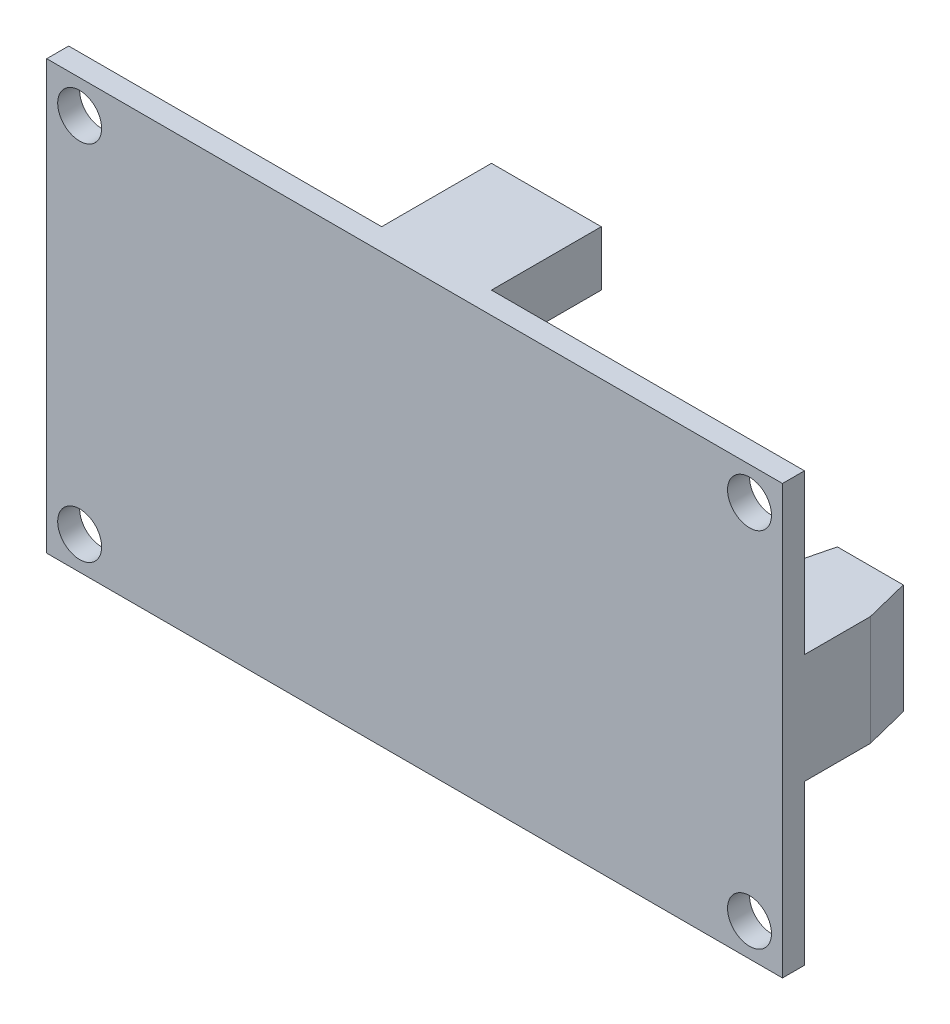
ISO-10303-21;
HEADER;
FILE_DESCRIPTION(('STEP AP214'),'2;1');
FILE_NAME('part.step','',(''),(''),'','','');
FILE_SCHEMA(('AUTOMOTIVE_DESIGN { 1 0 10303 214 1 1 1 1 }'));
ENDSEC;
DATA;
#1=APPLICATION_CONTEXT('core data for automotive mechanical design processes');
#2=APPLICATION_PROTOCOL_DEFINITION('international standard','automotive_design',2000,#1);
#3=PRODUCT_CONTEXT('',#1,'mechanical');
#4=PRODUCT('Part','Part','',(#3));
#5=PRODUCT_RELATED_PRODUCT_CATEGORY('part','',(#4));
#6=PRODUCT_DEFINITION_FORMATION('','',#4);
#7=PRODUCT_DEFINITION_CONTEXT('part definition',#1,'design');
#8=PRODUCT_DEFINITION('design','',#6,#7);
#9=PRODUCT_DEFINITION_SHAPE('','',#8);
#10=(LENGTH_UNIT() NAMED_UNIT(*) SI_UNIT(.MILLI.,.METRE.));
#11=(NAMED_UNIT(*) PLANE_ANGLE_UNIT() SI_UNIT($,.RADIAN.));
#12=(NAMED_UNIT(*) SI_UNIT($,.STERADIAN.) SOLID_ANGLE_UNIT());
#13=UNCERTAINTY_MEASURE_WITH_UNIT(LENGTH_MEASURE(1.E-05),#10,'distance_accuracy_value','');
#14=(GEOMETRIC_REPRESENTATION_CONTEXT(3) GLOBAL_UNCERTAINTY_ASSIGNED_CONTEXT((#13)) GLOBAL_UNIT_ASSIGNED_CONTEXT((#10,
#11,#12)) REPRESENTATION_CONTEXT('',''));
#15=CARTESIAN_POINT('',(0.,0.,0.));
#16=DIRECTION('',(0.,0.,1.));
#17=DIRECTION('',(1.,0.,0.));
#18=AXIS2_PLACEMENT_3D('',#15,#16,#17);
#19=CARTESIAN_POINT('',(0.,0.,0.));
#20=DIRECTION('',(0.,0.,1.));
#21=DIRECTION('',(1.,0.,0.));
#22=AXIS2_PLACEMENT_3D('',#19,#20,#21);
#23=PLANE('',#22);
#24=CARTESIAN_POINT('',(-30.5,16.5,0.));
#25=DIRECTION('',(0.,0.,1.));
#26=DIRECTION('',(1.,0.,0.));
#27=AXIS2_PLACEMENT_3D('',#24,#25,#26);
#28=CIRCLE('',#27,2.00000000000001);
#29=CARTESIAN_POINT('',(-28.5,16.5,0.));
#30=VERTEX_POINT('',#29);
#31=EDGE_CURVE('E391',#30,#30,#28,.T.);
#32=ORIENTED_EDGE('',*,*,#31,.T.);
#33=EDGE_LOOP('',(#32));
#34=FACE_BOUND('',#33,.T.);
#35=CARTESIAN_POINT('',(30.5,16.5,0.));
#36=DIRECTION('',(0.,0.,-1.));
#37=DIRECTION('',(-1.,0.,0.));
#38=AXIS2_PLACEMENT_3D('',#35,#36,#37);
#39=CIRCLE('',#38,2.00000000000001);
#40=CARTESIAN_POINT('',(28.5,16.5,0.));
#41=VERTEX_POINT('',#40);
#42=EDGE_CURVE('E385',#41,#41,#39,.T.);
#43=ORIENTED_EDGE('',*,*,#42,.F.);
#44=EDGE_LOOP('',(#43));
#45=FACE_BOUND('',#44,.T.);
#46=CARTESIAN_POINT('',(30.5,-16.5,0.));
#47=DIRECTION('',(0.,0.,1.));
#48=DIRECTION('',(-1.,0.,0.));
#49=AXIS2_PLACEMENT_3D('',#46,#47,#48);
#50=CIRCLE('',#49,2.00000000000001);
#51=CARTESIAN_POINT('',(28.5,-16.5,0.));
#52=VERTEX_POINT('',#51);
#53=EDGE_CURVE('E379',#52,#52,#50,.T.);
#54=ORIENTED_EDGE('',*,*,#53,.T.);
#55=EDGE_LOOP('',(#54));
#56=FACE_BOUND('',#55,.T.);
#57=CARTESIAN_POINT('',(-30.5,-16.5,0.));
#58=DIRECTION('',(0.,0.,-1.));
#59=DIRECTION('',(1.,0.,0.));
#60=AXIS2_PLACEMENT_3D('',#57,#58,#59);
#61=CIRCLE('',#60,2.00000000000001);
#62=CARTESIAN_POINT('',(-28.5,-16.5,0.));
#63=VERTEX_POINT('',#62);
#64=EDGE_CURVE('E373',#63,#63,#61,.T.);
#65=ORIENTED_EDGE('',*,*,#64,.F.);
#66=EDGE_LOOP('',(#65));
#67=FACE_BOUND('',#66,.T.);
#68=DIRECTION('',(0.,1.,0.));
#69=VECTOR('',#68,1.);
#70=CARTESIAN_POINT('',(-11.5,-19.5,0.));
#71=LINE('',#70,#69);
#72=CARTESIAN_POINT('',(-11.5,-19.5,0.));
#73=VERTEX_POINT('',#72);
#74=CARTESIAN_POINT('',(-11.5,-5.5,0.));
#75=VERTEX_POINT('',#74);
#76=EDGE_CURVE('E222',#73,#75,#71,.T.);
#77=ORIENTED_EDGE('',*,*,#76,.F.);
#78=DIRECTION('',(1.,0.,0.));
#79=VECTOR('',#78,1.);
#80=CARTESIAN_POINT('',(-33.5,-19.5,0.));
#81=LINE('',#80,#79);
#82=CARTESIAN_POINT('',(-33.5,-19.5,0.));
#83=VERTEX_POINT('',#82);
#84=EDGE_CURVE('E401',#83,#73,#81,.T.);
#85=ORIENTED_EDGE('',*,*,#84,.F.);
#86=DIRECTION('',(0.,-1.,0.));
#87=VECTOR('',#86,1.);
#88=CARTESIAN_POINT('',(-33.5,19.5,0.));
#89=LINE('',#88,#87);
#90=CARTESIAN_POINT('',(-33.5,-5.,0.));
#91=VERTEX_POINT('',#90);
#92=EDGE_CURVE('E431',#91,#83,#89,.T.);
#93=ORIENTED_EDGE('',*,*,#92,.F.);
#94=DIRECTION('',(1.,0.,0.));
#95=VECTOR('',#94,1.);
#96=CARTESIAN_POINT('',(-33.5,-5.,0.));
#97=LINE('',#96,#95);
#98=CARTESIAN_POINT('',(-25.5,-5.,0.));
#99=VERTEX_POINT('',#98);
#100=EDGE_CURVE('E289',#91,#99,#97,.T.);
#101=ORIENTED_EDGE('',*,*,#100,.T.);
#102=DIRECTION('',(0.,1.,0.));
#103=VECTOR('',#102,1.);
#104=CARTESIAN_POINT('',(-25.5,5.,0.));
#105=LINE('',#104,#103);
#106=CARTESIAN_POINT('',(-25.5,5.,0.));
#107=VERTEX_POINT('',#106);
#108=EDGE_CURVE('E295',#99,#107,#105,.T.);
#109=ORIENTED_EDGE('',*,*,#108,.T.);
#110=DIRECTION('',(-1.,0.,0.));
#111=VECTOR('',#110,1.);
#112=CARTESIAN_POINT('',(-33.5,5.,0.));
#113=LINE('',#112,#111);
#114=CARTESIAN_POINT('',(-33.5,5.,0.));
#115=VERTEX_POINT('',#114);
#116=EDGE_CURVE('E284',#107,#115,#113,.T.);
#117=ORIENTED_EDGE('',*,*,#116,.T.);
#118=CARTESIAN_POINT('',(-33.5,19.5,0.));
#119=VERTEX_POINT('',#118);
#120=EDGE_CURVE('E429',#119,#115,#89,.T.);
#121=ORIENTED_EDGE('',*,*,#120,.F.);
#122=DIRECTION('',(-1.,0.,0.));
#123=VECTOR('',#122,1.);
#124=CARTESIAN_POINT('',(-33.5,19.5,0.));
#125=LINE('',#124,#123);
#126=CARTESIAN_POINT('',(-5.,19.5,0.));
#127=VERTEX_POINT('',#126);
#128=EDGE_CURVE('E418',#127,#119,#125,.T.);
#129=ORIENTED_EDGE('',*,*,#128,.F.);
#130=DIRECTION('',(0.,1.,0.));
#131=VECTOR('',#130,1.);
#132=CARTESIAN_POINT('',(-5.,19.5,0.));
#133=LINE('',#132,#131);
#134=CARTESIAN_POINT('',(-5.,14.5,0.));
#135=VERTEX_POINT('',#134);
#136=EDGE_CURVE('E236',#135,#127,#133,.T.);
#137=ORIENTED_EDGE('',*,*,#136,.F.);
#138=DIRECTION('',(-1.,0.,0.));
#139=VECTOR('',#138,1.);
#140=CARTESIAN_POINT('',(5.,14.5,0.));
#141=LINE('',#140,#139);
#142=CARTESIAN_POINT('',(5.,14.5,0.));
#143=VERTEX_POINT('',#142);
#144=EDGE_CURVE('E227',#143,#135,#141,.T.);
#145=ORIENTED_EDGE('',*,*,#144,.F.);
#146=DIRECTION('',(0.,-1.,0.));
#147=VECTOR('',#146,1.);
#148=CARTESIAN_POINT('',(5.,19.5,0.));
#149=LINE('',#148,#147);
#150=CARTESIAN_POINT('',(5.,19.5,0.));
#151=VERTEX_POINT('',#150);
#152=EDGE_CURVE('E224',#151,#143,#149,.T.);
#153=ORIENTED_EDGE('',*,*,#152,.F.);
#154=CARTESIAN_POINT('',(33.5,19.5,0.));
#155=VERTEX_POINT('',#154);
#156=EDGE_CURVE('E410',#155,#151,#125,.T.);
#157=ORIENTED_EDGE('',*,*,#156,.F.);
#158=DIRECTION('',(0.,1.,0.));
#159=VECTOR('',#158,1.);
#160=CARTESIAN_POINT('',(33.5,19.5,0.));
#161=LINE('',#160,#159);
#162=CARTESIAN_POINT('',(33.5,5.,0.));
#163=VERTEX_POINT('',#162);
#164=EDGE_CURVE('E394',#163,#155,#161,.T.);
#165=ORIENTED_EDGE('',*,*,#164,.F.);
#166=DIRECTION('',(1.,0.,0.));
#167=VECTOR('',#166,1.);
#168=CARTESIAN_POINT('',(33.5,5.,0.));
#169=LINE('',#168,#167);
#170=CARTESIAN_POINT('',(25.5,5.,0.));
#171=VERTEX_POINT('',#170);
#172=EDGE_CURVE('E344',#171,#163,#169,.T.);
#173=ORIENTED_EDGE('',*,*,#172,.F.);
#174=DIRECTION('',(0.,1.,0.));
#175=VECTOR('',#174,1.);
#176=CARTESIAN_POINT('',(25.5,5.,0.));
#177=LINE('',#176,#175);
#178=CARTESIAN_POINT('',(25.5,-5.,0.));
#179=VERTEX_POINT('',#178);
#180=EDGE_CURVE('E347',#179,#171,#177,.T.);
#181=ORIENTED_EDGE('',*,*,#180,.F.);
#182=DIRECTION('',(-1.,0.,0.));
#183=VECTOR('',#182,1.);
#184=CARTESIAN_POINT('',(33.5,-5.,0.));
#185=LINE('',#184,#183);
#186=CARTESIAN_POINT('',(33.5,-5.,0.));
#187=VERTEX_POINT('',#186);
#188=EDGE_CURVE('E338',#187,#179,#185,.T.);
#189=ORIENTED_EDGE('',*,*,#188,.F.);
#190=CARTESIAN_POINT('',(33.5,-19.5,0.));
#191=VERTEX_POINT('',#190);
#192=EDGE_CURVE('E416',#191,#187,#161,.T.);
#193=ORIENTED_EDGE('',*,*,#192,.F.);
#194=CARTESIAN_POINT('',(11.5,-19.5,0.));
#195=VERTEX_POINT('',#194);
#196=EDGE_CURVE('E428',#195,#191,#81,.T.);
#197=ORIENTED_EDGE('',*,*,#196,.F.);
#198=DIRECTION('',(0.,-1.,0.));
#199=VECTOR('',#198,1.);
#200=CARTESIAN_POINT('',(11.5,-19.5,0.));
#201=LINE('',#200,#199);
#202=CARTESIAN_POINT('',(11.5,-5.5,0.));
#203=VERTEX_POINT('',#202);
#204=EDGE_CURVE('E218',#203,#195,#201,.T.);
#205=ORIENTED_EDGE('',*,*,#204,.F.);
#206=DIRECTION('',(1.,0.,0.));
#207=VECTOR('',#206,1.);
#208=CARTESIAN_POINT('',(-11.5,-5.5,0.));
#209=LINE('',#208,#207);
#210=EDGE_CURVE('E848',#75,#203,#209,.T.);
#211=ORIENTED_EDGE('',*,*,#210,.F.);
#212=EDGE_LOOP('',(#77,#85,#93,#101,#109,#117,#121,#129,#137,#145,#153,#157,#165,#173,#181,#189,
#193,#197,#205,#211));
#213=FACE_BOUND('',#212,.T.);
#214=ADVANCED_FACE('F35',(#34,#45,#56,#67,#213),#23,.F.);
#215=CARTESIAN_POINT('',(-33.5,5.,-10.));
#216=DIRECTION('',(0.,1.,0.));
#217=DIRECTION('',(0.,0.,1.));
#218=AXIS2_PLACEMENT_3D('',#215,#216,#217);
#219=PLANE('',#218);
#220=DIRECTION('',(0.,0.,1.));
#221=VECTOR('',#220,1.);
#222=CARTESIAN_POINT('',(-25.5,5.,-10.));
#223=LINE('',#222,#221);
#224=CARTESIAN_POINT('',(-25.5,5.,-6.));
#225=VERTEX_POINT('',#224);
#226=EDGE_CURVE('E303',#225,#107,#223,.T.);
#227=ORIENTED_EDGE('',*,*,#226,.F.);
#228=DIRECTION('',(0.242535625036333,0.,0.970142500145332));
#229=VECTOR('',#228,1.);
#230=CARTESIAN_POINT('',(-26.5,5.,-10.));
#231=LINE('',#230,#229);
#232=CARTESIAN_POINT('',(-26.5,5.,-10.));
#233=VERTEX_POINT('',#232);
#234=EDGE_CURVE('E265',#233,#225,#231,.T.);
#235=ORIENTED_EDGE('',*,*,#234,.F.);
#236=DIRECTION('',(-1.,0.,0.));
#237=VECTOR('',#236,1.);
#238=CARTESIAN_POINT('',(-33.5,5.,-10.));
#239=LINE('',#238,#237);
#240=CARTESIAN_POINT('',(-32.5,5.,-10.));
#241=VERTEX_POINT('',#240);
#242=EDGE_CURVE('E286',#233,#241,#239,.T.);
#243=ORIENTED_EDGE('',*,*,#242,.T.);
#244=DIRECTION('',(0.242535625036333,0.,-0.970142500145332));
#245=VECTOR('',#244,1.);
#246=CARTESIAN_POINT('',(-32.5,5.,-10.));
#247=LINE('',#246,#245);
#248=CARTESIAN_POINT('',(-33.5,5.,-6.));
#249=VERTEX_POINT('',#248);
#250=EDGE_CURVE('E275',#249,#241,#247,.T.);
#251=ORIENTED_EDGE('',*,*,#250,.F.);
#252=DIRECTION('',(0.,0.,1.));
#253=VECTOR('',#252,1.);
#254=CARTESIAN_POINT('',(-33.5,5.,-10.));
#255=LINE('',#254,#253);
#256=EDGE_CURVE('E305',#249,#115,#255,.T.);
#257=ORIENTED_EDGE('',*,*,#256,.T.);
#258=ORIENTED_EDGE('',*,*,#116,.F.);
#259=EDGE_LOOP('',(#227,#235,#243,#251,#257,#258));
#260=FACE_BOUND('',#259,.T.);
#261=ADVANCED_FACE('F451',(#260),#219,.T.);
#262=CARTESIAN_POINT('',(-33.5,-5.,-10.));
#263=DIRECTION('',(0.,-1.,0.));
#264=DIRECTION('',(0.,0.,-1.));
#265=AXIS2_PLACEMENT_3D('',#262,#263,#264);
#266=PLANE('',#265);
#267=DIRECTION('',(1.,0.,0.));
#268=VECTOR('',#267,1.);
#269=CARTESIAN_POINT('',(-33.5,-5.,-10.));
#270=LINE('',#269,#268);
#271=CARTESIAN_POINT('',(-32.5,-5.,-10.));
#272=VERTEX_POINT('',#271);
#273=CARTESIAN_POINT('',(-26.5,-5.,-10.));
#274=VERTEX_POINT('',#273);
#275=EDGE_CURVE('E288',#272,#274,#270,.T.);
#276=ORIENTED_EDGE('',*,*,#275,.T.);
#277=DIRECTION('',(0.242535625036333,0.,0.970142500145332));
#278=VECTOR('',#277,1.);
#279=CARTESIAN_POINT('',(-26.5,-5.,-10.));
#280=LINE('',#279,#278);
#281=CARTESIAN_POINT('',(-25.5,-5.,-6.));
#282=VERTEX_POINT('',#281);
#283=EDGE_CURVE('E262',#274,#282,#280,.T.);
#284=ORIENTED_EDGE('',*,*,#283,.T.);
#285=DIRECTION('',(0.,0.,1.));
#286=VECTOR('',#285,1.);
#287=CARTESIAN_POINT('',(-25.5,-5.,-10.));
#288=LINE('',#287,#286);
#289=EDGE_CURVE('E301',#282,#99,#288,.T.);
#290=ORIENTED_EDGE('',*,*,#289,.T.);
#291=ORIENTED_EDGE('',*,*,#100,.F.);
#292=DIRECTION('',(0.,0.,1.));
#293=VECTOR('',#292,1.);
#294=CARTESIAN_POINT('',(-33.5,-5.,-10.));
#295=LINE('',#294,#293);
#296=CARTESIAN_POINT('',(-33.5,-5.,-6.));
#297=VERTEX_POINT('',#296);
#298=EDGE_CURVE('E292',#297,#91,#295,.T.);
#299=ORIENTED_EDGE('',*,*,#298,.F.);
#300=DIRECTION('',(0.242535625036333,0.,-0.970142500145332));
#301=VECTOR('',#300,1.);
#302=CARTESIAN_POINT('',(-32.5,-5.,-10.));
#303=LINE('',#302,#301);
#304=EDGE_CURVE('E273',#297,#272,#303,.T.);
#305=ORIENTED_EDGE('',*,*,#304,.T.);
#306=EDGE_LOOP('',(#276,#284,#290,#291,#299,#305));
#307=FACE_BOUND('',#306,.T.);
#308=ADVANCED_FACE('F458',(#307),#266,.T.);
#309=CARTESIAN_POINT('',(0.,0.,-10.));
#310=DIRECTION('',(0.,0.,-1.));
#311=DIRECTION('',(1.,0.,0.));
#312=AXIS2_PLACEMENT_3D('',#309,#310,#311);
#313=PLANE('',#312);
#314=CARTESIAN_POINT('',(-29.5,-2.,-10.));
#315=DIRECTION('',(0.,0.,1.));
#316=DIRECTION('',(1.,0.,0.));
#317=AXIS2_PLACEMENT_3D('',#314,#315,#316);
#318=CIRCLE('',#317,1.5);
#319=CARTESIAN_POINT('',(-28.,-2.,-10.));
#320=VERTEX_POINT('',#319);
#321=EDGE_CURVE('E252',#320,#320,#318,.T.);
#322=ORIENTED_EDGE('',*,*,#321,.T.);
#323=EDGE_LOOP('',(#322));
#324=FACE_BOUND('',#323,.T.);
#325=CARTESIAN_POINT('',(-29.5,2.,-10.));
#326=DIRECTION('',(0.,0.,1.));
#327=DIRECTION('',(1.,0.,0.));
#328=AXIS2_PLACEMENT_3D('',#325,#326,#327);
#329=CIRCLE('',#328,1.5);
#330=CARTESIAN_POINT('',(-28.,2.,-10.));
#331=VERTEX_POINT('',#330);
#332=EDGE_CURVE('E256',#331,#331,#329,.T.);
#333=ORIENTED_EDGE('',*,*,#332,.T.);
#334=EDGE_LOOP('',(#333));
#335=FACE_BOUND('',#334,.T.);
#336=ORIENTED_EDGE('',*,*,#242,.F.);
#337=DIRECTION('',(0.,-1.,0.));
#338=VECTOR('',#337,1.);
#339=CARTESIAN_POINT('',(-26.5,5.,-10.));
#340=LINE('',#339,#338);
#341=EDGE_CURVE('E270',#233,#274,#340,.T.);
#342=ORIENTED_EDGE('',*,*,#341,.T.);
#343=ORIENTED_EDGE('',*,*,#275,.F.);
#344=DIRECTION('',(0.,-1.,0.));
#345=VECTOR('',#344,1.);
#346=CARTESIAN_POINT('',(-32.5,5.,-10.));
#347=LINE('',#346,#345);
#348=EDGE_CURVE('E278',#241,#272,#347,.T.);
#349=ORIENTED_EDGE('',*,*,#348,.F.);
#350=EDGE_LOOP('',(#336,#342,#343,#349));
#351=FACE_BOUND('',#350,.T.);
#352=ADVANCED_FACE('F528',(#324,#335,#351),#313,.T.);
#353=CARTESIAN_POINT('',(-25.5,5.,-10.));
#354=DIRECTION('',(1.,0.,0.));
#355=DIRECTION('',(0.,0.,-1.));
#356=AXIS2_PLACEMENT_3D('',#353,#354,#355);
#357=PLANE('',#356);
#358=ORIENTED_EDGE('',*,*,#289,.F.);
#359=DIRECTION('',(0.,-1.,0.));
#360=VECTOR('',#359,1.);
#361=CARTESIAN_POINT('',(-25.5,5.,-6.));
#362=LINE('',#361,#360);
#363=EDGE_CURVE('E267',#225,#282,#362,.T.);
#364=ORIENTED_EDGE('',*,*,#363,.F.);
#365=ORIENTED_EDGE('',*,*,#226,.T.);
#366=ORIENTED_EDGE('',*,*,#108,.F.);
#367=EDGE_LOOP('',(#358,#364,#365,#366));
#368=FACE_BOUND('',#367,.T.);
#369=ADVANCED_FACE('F508',(#368),#357,.T.);
#370=CARTESIAN_POINT('',(-33.5,19.5,2.));
#371=DIRECTION('',(1.,0.,0.));
#372=DIRECTION('',(0.,0.,-1.));
#373=AXIS2_PLACEMENT_3D('',#370,#371,#372);
#374=PLANE('',#373);
#375=DIRECTION('',(0.,-1.,0.));
#376=VECTOR('',#375,1.);
#377=CARTESIAN_POINT('',(-33.5,5.,-6.));
#378=LINE('',#377,#376);
#379=EDGE_CURVE('E281',#249,#297,#378,.T.);
#380=ORIENTED_EDGE('',*,*,#379,.T.);
#381=ORIENTED_EDGE('',*,*,#298,.T.);
#382=ORIENTED_EDGE('',*,*,#92,.T.);
#383=DIRECTION('',(0.,0.,-1.));
#384=VECTOR('',#383,1.);
#385=CARTESIAN_POINT('',(-33.5,-19.5,2.));
#386=LINE('',#385,#384);
#387=CARTESIAN_POINT('',(-33.5,-19.5,2.));
#388=VERTEX_POINT('',#387);
#389=EDGE_CURVE('E422',#388,#83,#386,.T.);
#390=ORIENTED_EDGE('',*,*,#389,.F.);
#391=DIRECTION('',(0.,-1.,0.));
#392=VECTOR('',#391,1.);
#393=CARTESIAN_POINT('',(-33.5,19.5,2.));
#394=LINE('',#393,#392);
#395=CARTESIAN_POINT('',(-33.5,19.5,2.));
#396=VERTEX_POINT('',#395);
#397=EDGE_CURVE('E403',#396,#388,#394,.T.);
#398=ORIENTED_EDGE('',*,*,#397,.F.);
#399=DIRECTION('',(0.,0.,-1.));
#400=VECTOR('',#399,1.);
#401=CARTESIAN_POINT('',(-33.5,19.5,2.));
#402=LINE('',#401,#400);
#403=EDGE_CURVE('E45',#396,#119,#402,.T.);
#404=ORIENTED_EDGE('',*,*,#403,.T.);
#405=ORIENTED_EDGE('',*,*,#120,.T.);
#406=ORIENTED_EDGE('',*,*,#256,.F.);
#407=EDGE_LOOP('',(#380,#381,#382,#390,#398,#404,#405,#406));
#408=FACE_BOUND('',#407,.T.);
#409=ADVANCED_FACE('F446',(#408),#374,.F.);
#410=CARTESIAN_POINT('',(33.5,19.5,2.));
#411=DIRECTION('',(-1.,0.,0.));
#412=DIRECTION('',(0.,0.,1.));
#413=AXIS2_PLACEMENT_3D('',#410,#411,#412);
#414=PLANE('',#413);
#415=DIRECTION('',(0.,0.,1.));
#416=VECTOR('',#415,1.);
#417=CARTESIAN_POINT('',(33.5,-5.,-10.));
#418=LINE('',#417,#416);
#419=CARTESIAN_POINT('',(33.5,-5.,-6.));
#420=VERTEX_POINT('',#419);
#421=EDGE_CURVE('E39',#420,#187,#418,.T.);
#422=ORIENTED_EDGE('',*,*,#421,.F.);
#423=DIRECTION('',(0.,-1.,0.));
#424=VECTOR('',#423,1.);
#425=CARTESIAN_POINT('',(33.5,5.,-6.));
#426=LINE('',#425,#424);
#427=CARTESIAN_POINT('',(33.5,5.,-6.));
#428=VERTEX_POINT('',#427);
#429=EDGE_CURVE('E333',#428,#420,#426,.T.);
#430=ORIENTED_EDGE('',*,*,#429,.F.);
#431=DIRECTION('',(0.,0.,1.));
#432=VECTOR('',#431,1.);
#433=CARTESIAN_POINT('',(33.5,5.,-10.));
#434=LINE('',#433,#432);
#435=EDGE_CURVE('E346',#428,#163,#434,.T.);
#436=ORIENTED_EDGE('',*,*,#435,.T.);
#437=ORIENTED_EDGE('',*,*,#164,.T.);
#438=DIRECTION('',(0.,0.,-1.));
#439=VECTOR('',#438,1.);
#440=CARTESIAN_POINT('',(33.5,19.5,2.));
#441=LINE('',#440,#439);
#442=CARTESIAN_POINT('',(33.5,19.5,2.));
#443=VERTEX_POINT('',#442);
#444=EDGE_CURVE('E11',#443,#155,#441,.T.);
#445=ORIENTED_EDGE('',*,*,#444,.F.);
#446=DIRECTION('',(0.,1.,0.));
#447=VECTOR('',#446,1.);
#448=CARTESIAN_POINT('',(33.5,19.5,2.));
#449=LINE('',#448,#447);
#450=CARTESIAN_POINT('',(33.5,-19.5,2.));
#451=VERTEX_POINT('',#450);
#452=EDGE_CURVE('E397',#451,#443,#449,.T.);
#453=ORIENTED_EDGE('',*,*,#452,.F.);
#454=DIRECTION('',(0.,0.,-1.));
#455=VECTOR('',#454,1.);
#456=CARTESIAN_POINT('',(33.5,-19.5,2.));
#457=LINE('',#456,#455);
#458=EDGE_CURVE('E407',#451,#191,#457,.T.);
#459=ORIENTED_EDGE('',*,*,#458,.T.);
#460=ORIENTED_EDGE('',*,*,#192,.T.);
#461=EDGE_LOOP('',(#422,#430,#436,#437,#445,#453,#459,#460));
#462=FACE_BOUND('',#461,.T.);
#463=ADVANCED_FACE('F37',(#462),#414,.F.);
#464=CARTESIAN_POINT('',(-33.5,19.5,2.));
#465=DIRECTION('',(0.,-1.,0.));
#466=DIRECTION('',(0.,0.,-1.));
#467=AXIS2_PLACEMENT_3D('',#464,#465,#466);
#468=PLANE('',#467);
#469=ORIENTED_EDGE('',*,*,#156,.T.);
#470=DIRECTION('',(0.,0.,1.));
#471=VECTOR('',#470,1.);
#472=CARTESIAN_POINT('',(5.,19.5,-10.));
#473=LINE('',#472,#471);
#474=CARTESIAN_POINT('',(5.,19.5,-10.));
#475=VERTEX_POINT('',#474);
#476=EDGE_CURVE('E241',#475,#151,#473,.T.);
#477=ORIENTED_EDGE('',*,*,#476,.F.);
#478=DIRECTION('',(1.,0.,0.));
#479=VECTOR('',#478,1.);
#480=CARTESIAN_POINT('',(5.,19.5,-10.));
#481=LINE('',#480,#479);
#482=CARTESIAN_POINT('',(-5.,19.5,-10.));
#483=VERTEX_POINT('',#482);
#484=EDGE_CURVE('E240',#483,#475,#481,.T.);
#485=ORIENTED_EDGE('',*,*,#484,.F.);
#486=DIRECTION('',(0.,0.,1.));
#487=VECTOR('',#486,1.);
#488=CARTESIAN_POINT('',(-5.,19.5,-10.));
#489=LINE('',#488,#487);
#490=EDGE_CURVE('E61',#483,#127,#489,.T.);
#491=ORIENTED_EDGE('',*,*,#490,.T.);
#492=ORIENTED_EDGE('',*,*,#128,.T.);
#493=ORIENTED_EDGE('',*,*,#403,.F.);
#494=DIRECTION('',(-1.,0.,0.));
#495=VECTOR('',#494,1.);
#496=CARTESIAN_POINT('',(-33.5,19.5,2.));
#497=LINE('',#496,#495);
#498=EDGE_CURVE('E400',#443,#396,#497,.T.);
#499=ORIENTED_EDGE('',*,*,#498,.F.);
#500=ORIENTED_EDGE('',*,*,#444,.T.);
#501=EDGE_LOOP('',(#469,#477,#485,#491,#492,#493,#499,#500));
#502=FACE_BOUND('',#501,.T.);
#503=ADVANCED_FACE('F442',(#502),#468,.F.);
#504=CARTESIAN_POINT('',(-33.5,-19.5,2.));
#505=DIRECTION('',(0.,1.,0.));
#506=DIRECTION('',(0.,0.,1.));
#507=AXIS2_PLACEMENT_3D('',#504,#505,#506);
#508=PLANE('',#507);
#509=ORIENTED_EDGE('',*,*,#84,.T.);
#510=DIRECTION('',(0.,0.,1.));
#511=VECTOR('',#510,1.);
#512=CARTESIAN_POINT('',(-11.5,-19.5,-7.5));
#513=LINE('',#512,#511);
#514=CARTESIAN_POINT('',(-11.5,-19.5,-7.5));
#515=VERTEX_POINT('',#514);
#516=EDGE_CURVE('E463',#515,#73,#513,.T.);
#517=ORIENTED_EDGE('',*,*,#516,.F.);
#518=DIRECTION('',(-1.,0.,0.));
#519=VECTOR('',#518,1.);
#520=CARTESIAN_POINT('',(-11.5,-19.5,-7.5));
#521=LINE('',#520,#519);
#522=CARTESIAN_POINT('',(11.5,-19.5,-7.5));
#523=VERTEX_POINT('',#522);
#524=EDGE_CURVE('E215',#523,#515,#521,.T.);
#525=ORIENTED_EDGE('',*,*,#524,.F.);
#526=DIRECTION('',(0.,0.,1.));
#527=VECTOR('',#526,1.);
#528=CARTESIAN_POINT('',(11.5,-19.5,-7.5));
#529=LINE('',#528,#527);
#530=EDGE_CURVE('E53',#523,#195,#529,.T.);
#531=ORIENTED_EDGE('',*,*,#530,.T.);
#532=ORIENTED_EDGE('',*,*,#196,.T.);
#533=ORIENTED_EDGE('',*,*,#458,.F.);
#534=DIRECTION('',(1.,0.,0.));
#535=VECTOR('',#534,1.);
#536=CARTESIAN_POINT('',(-33.5,-19.5,2.));
#537=LINE('',#536,#535);
#538=EDGE_CURVE('E405',#388,#451,#537,.T.);
#539=ORIENTED_EDGE('',*,*,#538,.F.);
#540=ORIENTED_EDGE('',*,*,#389,.T.);
#541=EDGE_LOOP('',(#509,#517,#525,#531,#532,#533,#539,#540));
#542=FACE_BOUND('',#541,.T.);
#543=ADVANCED_FACE('F462',(#542),#508,.F.);
#544=CARTESIAN_POINT('',(0.,0.,2.));
#545=DIRECTION('',(0.,0.,1.));
#546=DIRECTION('',(1.,0.,0.));
#547=AXIS2_PLACEMENT_3D('',#544,#545,#546);
#548=PLANE('',#547);
#549=CARTESIAN_POINT('',(-30.5,-16.5,2.));
#550=DIRECTION('',(0.,0.,-1.));
#551=DIRECTION('',(1.,0.,0.));
#552=AXIS2_PLACEMENT_3D('',#549,#550,#551);
#553=CIRCLE('',#552,2.00000000000001);
#554=CARTESIAN_POINT('',(-28.5,-16.5,2.));
#555=VERTEX_POINT('',#554);
#556=EDGE_CURVE('E371',#555,#555,#553,.T.);
#557=ORIENTED_EDGE('',*,*,#556,.T.);
#558=EDGE_LOOP('',(#557));
#559=FACE_BOUND('',#558,.T.);
#560=CARTESIAN_POINT('',(30.5,-16.5,2.));
#561=DIRECTION('',(0.,0.,1.));
#562=DIRECTION('',(-1.,0.,0.));
#563=AXIS2_PLACEMENT_3D('',#560,#561,#562);
#564=CIRCLE('',#563,2.00000000000001);
#565=CARTESIAN_POINT('',(28.5,-16.5,2.));
#566=VERTEX_POINT('',#565);
#567=EDGE_CURVE('E376',#566,#566,#564,.T.);
#568=ORIENTED_EDGE('',*,*,#567,.F.);
#569=EDGE_LOOP('',(#568));
#570=FACE_BOUND('',#569,.T.);
#571=CARTESIAN_POINT('',(30.5,16.5,2.));
#572=DIRECTION('',(0.,0.,-1.));
#573=DIRECTION('',(-1.,0.,0.));
#574=AXIS2_PLACEMENT_3D('',#571,#572,#573);
#575=CIRCLE('',#574,2.00000000000001);
#576=CARTESIAN_POINT('',(28.5,16.5,2.));
#577=VERTEX_POINT('',#576);
#578=EDGE_CURVE('E382',#577,#577,#575,.T.);
#579=ORIENTED_EDGE('',*,*,#578,.T.);
#580=EDGE_LOOP('',(#579));
#581=FACE_BOUND('',#580,.T.);
#582=CARTESIAN_POINT('',(-30.5,16.5,2.));
#583=DIRECTION('',(0.,0.,1.));
#584=DIRECTION('',(1.,0.,0.));
#585=AXIS2_PLACEMENT_3D('',#582,#583,#584);
#586=CIRCLE('',#585,2.00000000000001);
#587=CARTESIAN_POINT('',(-28.5,16.5,2.));
#588=VERTEX_POINT('',#587);
#589=EDGE_CURVE('E388',#588,#588,#586,.T.);
#590=ORIENTED_EDGE('',*,*,#589,.F.);
#591=EDGE_LOOP('',(#590));
#592=FACE_BOUND('',#591,.T.);
#593=ORIENTED_EDGE('',*,*,#452,.T.);
#594=ORIENTED_EDGE('',*,*,#498,.T.);
#595=ORIENTED_EDGE('',*,*,#397,.T.);
#596=ORIENTED_EDGE('',*,*,#538,.T.);
#597=EDGE_LOOP('',(#593,#594,#595,#596));
#598=FACE_BOUND('',#597,.T.);
#599=ADVANCED_FACE('F468',(#559,#570,#581,#592,#598),#548,.T.);
#600=CARTESIAN_POINT('',(-30.5,16.5,0.));
#601=DIRECTION('',(0.,0.,1.));
#602=DIRECTION('',(1.,0.,0.));
#603=AXIS2_PLACEMENT_3D('',#600,#601,#602);
#604=CYLINDRICAL_SURFACE('',#603,2.00000000000001);
#605=ORIENTED_EDGE('',*,*,#31,.F.);
#606=EDGE_LOOP('',(#605));
#607=FACE_BOUND('',#606,.T.);
#608=ORIENTED_EDGE('',*,*,#589,.T.);
#609=EDGE_LOOP('',(#608));
#610=FACE_BOUND('',#609,.T.);
#611=ADVANCED_FACE('F673',(#607,#610),#604,.F.);
#612=CARTESIAN_POINT('',(30.5,16.5,0.));
#613=DIRECTION('',(0.,0.,1.));
#614=DIRECTION('',(1.,0.,0.));
#615=AXIS2_PLACEMENT_3D('',#612,#613,#614);
#616=CYLINDRICAL_SURFACE('',#615,2.00000000000001);
#617=ORIENTED_EDGE('',*,*,#42,.T.);
#618=EDGE_LOOP('',(#617));
#619=FACE_BOUND('',#618,.T.);
#620=ORIENTED_EDGE('',*,*,#578,.F.);
#621=EDGE_LOOP('',(#620));
#622=FACE_BOUND('',#621,.T.);
#623=ADVANCED_FACE('F664',(#619,#622),#616,.F.);
#624=CARTESIAN_POINT('',(30.5,-16.5,0.));
#625=DIRECTION('',(0.,0.,1.));
#626=DIRECTION('',(1.,0.,0.));
#627=AXIS2_PLACEMENT_3D('',#624,#625,#626);
#628=CYLINDRICAL_SURFACE('',#627,2.00000000000001);
#629=ORIENTED_EDGE('',*,*,#53,.F.);
#630=EDGE_LOOP('',(#629));
#631=FACE_BOUND('',#630,.T.);
#632=ORIENTED_EDGE('',*,*,#567,.T.);
#633=EDGE_LOOP('',(#632));
#634=FACE_BOUND('',#633,.T.);
#635=ADVANCED_FACE('F656',(#631,#634),#628,.F.);
#636=CARTESIAN_POINT('',(-30.5,-16.5,0.));
#637=DIRECTION('',(0.,0.,1.));
#638=DIRECTION('',(1.,0.,0.));
#639=AXIS2_PLACEMENT_3D('',#636,#637,#638);
#640=CYLINDRICAL_SURFACE('',#639,2.00000000000001);
#641=ORIENTED_EDGE('',*,*,#64,.T.);
#642=EDGE_LOOP('',(#641));
#643=FACE_BOUND('',#642,.T.);
#644=ORIENTED_EDGE('',*,*,#556,.F.);
#645=EDGE_LOOP('',(#644));
#646=FACE_BOUND('',#645,.T.);
#647=ADVANCED_FACE('F647',(#643,#646),#640,.F.);
#648=CARTESIAN_POINT('',(33.5,-5.,-10.));
#649=DIRECTION('',(0.,1.,0.));
#650=DIRECTION('',(0.,0.,1.));
#651=AXIS2_PLACEMENT_3D('',#648,#649,#650);
#652=PLANE('',#651);
#653=DIRECTION('',(0.,0.,1.));
#654=VECTOR('',#653,1.);
#655=CARTESIAN_POINT('',(25.5,-5.,-10.));
#656=LINE('',#655,#654);
#657=CARTESIAN_POINT('',(25.5,-5.,-6.));
#658=VERTEX_POINT('',#657);
#659=EDGE_CURVE('E364',#658,#179,#656,.T.);
#660=ORIENTED_EDGE('',*,*,#659,.F.);
#661=DIRECTION('',(-0.242535625036333,0.,0.970142500145332));
#662=VECTOR('',#661,1.);
#663=CARTESIAN_POINT('',(26.5,-5.,-10.));
#664=LINE('',#663,#662);
#665=CARTESIAN_POINT('',(26.5,-5.,-10.));
#666=VERTEX_POINT('',#665);
#667=EDGE_CURVE('E317',#666,#658,#664,.T.);
#668=ORIENTED_EDGE('',*,*,#667,.F.);
#669=DIRECTION('',(-1.,0.,0.));
#670=VECTOR('',#669,1.);
#671=CARTESIAN_POINT('',(33.5,-5.,-10.));
#672=LINE('',#671,#670);
#673=CARTESIAN_POINT('',(32.5,-5.,-10.));
#674=VERTEX_POINT('',#673);
#675=EDGE_CURVE('E340',#674,#666,#672,.T.);
#676=ORIENTED_EDGE('',*,*,#675,.F.);
#677=DIRECTION('',(-0.242535625036333,0.,-0.970142500145332));
#678=VECTOR('',#677,1.);
#679=CARTESIAN_POINT('',(32.5,-5.,-10.));
#680=LINE('',#679,#678);
#681=EDGE_CURVE('E328',#420,#674,#680,.T.);
#682=ORIENTED_EDGE('',*,*,#681,.F.);
#683=ORIENTED_EDGE('',*,*,#421,.T.);
#684=ORIENTED_EDGE('',*,*,#188,.T.);
#685=EDGE_LOOP('',(#660,#668,#676,#682,#683,#684));
#686=FACE_BOUND('',#685,.T.);
#687=ADVANCED_FACE('F639',(#686),#652,.F.);
#688=CARTESIAN_POINT('',(25.5,5.,-10.));
#689=DIRECTION('',(1.,0.,0.));
#690=DIRECTION('',(0.,0.,-1.));
#691=AXIS2_PLACEMENT_3D('',#688,#689,#690);
#692=PLANE('',#691);
#693=DIRECTION('',(0.,0.,1.));
#694=VECTOR('',#693,1.);
#695=CARTESIAN_POINT('',(25.5,5.,-10.));
#696=LINE('',#695,#694);
#697=CARTESIAN_POINT('',(25.5,5.,-6.));
#698=VERTEX_POINT('',#697);
#699=EDGE_CURVE('E352',#698,#171,#696,.T.);
#700=ORIENTED_EDGE('',*,*,#699,.F.);
#701=DIRECTION('',(0.,-1.,0.));
#702=VECTOR('',#701,1.);
#703=CARTESIAN_POINT('',(25.5,5.,-6.));
#704=LINE('',#703,#702);
#705=EDGE_CURVE('E325',#698,#658,#704,.T.);
#706=ORIENTED_EDGE('',*,*,#705,.T.);
#707=ORIENTED_EDGE('',*,*,#659,.T.);
#708=ORIENTED_EDGE('',*,*,#180,.T.);
#709=EDGE_LOOP('',(#700,#706,#707,#708));
#710=FACE_BOUND('',#709,.T.);
#711=ADVANCED_FACE('F631',(#710),#692,.F.);
#712=CARTESIAN_POINT('',(33.5,5.,-10.));
#713=DIRECTION('',(0.,-1.,0.));
#714=DIRECTION('',(0.,0.,-1.));
#715=AXIS2_PLACEMENT_3D('',#712,#713,#714);
#716=PLANE('',#715);
#717=DIRECTION('',(1.,0.,0.));
#718=VECTOR('',#717,1.);
#719=CARTESIAN_POINT('',(33.5,5.,-10.));
#720=LINE('',#719,#718);
#721=CARTESIAN_POINT('',(26.5,5.,-10.));
#722=VERTEX_POINT('',#721);
#723=CARTESIAN_POINT('',(32.5,5.,-10.));
#724=VERTEX_POINT('',#723);
#725=EDGE_CURVE('E343',#722,#724,#720,.T.);
#726=ORIENTED_EDGE('',*,*,#725,.F.);
#727=DIRECTION('',(-0.242535625036333,0.,0.970142500145332));
#728=VECTOR('',#727,1.);
#729=CARTESIAN_POINT('',(26.5,5.,-10.));
#730=LINE('',#729,#728);
#731=EDGE_CURVE('E320',#722,#698,#730,.T.);
#732=ORIENTED_EDGE('',*,*,#731,.T.);
#733=ORIENTED_EDGE('',*,*,#699,.T.);
#734=ORIENTED_EDGE('',*,*,#172,.T.);
#735=ORIENTED_EDGE('',*,*,#435,.F.);
#736=DIRECTION('',(-0.242535625036333,0.,-0.970142500145332));
#737=VECTOR('',#736,1.);
#738=CARTESIAN_POINT('',(32.5,5.,-10.));
#739=LINE('',#738,#737);
#740=EDGE_CURVE('E330',#428,#724,#739,.T.);
#741=ORIENTED_EDGE('',*,*,#740,.T.);
#742=EDGE_LOOP('',(#726,#732,#733,#734,#735,#741));
#743=FACE_BOUND('',#742,.T.);
#744=ADVANCED_FACE('F605',(#743),#716,.F.);
#745=CARTESIAN_POINT('',(0.,0.,-10.));
#746=DIRECTION('',(0.,0.,-1.));
#747=DIRECTION('',(-1.,0.,0.));
#748=AXIS2_PLACEMENT_3D('',#745,#746,#747);
#749=PLANE('',#748);
#750=CARTESIAN_POINT('',(29.5,-2.,-10.));
#751=DIRECTION('',(0.,0.,-1.));
#752=DIRECTION('',(-1.,0.,0.));
#753=AXIS2_PLACEMENT_3D('',#750,#751,#752);
#754=CIRCLE('',#753,1.5);
#755=CARTESIAN_POINT('',(28.,-2.,-10.));
#756=VERTEX_POINT('',#755);
#757=EDGE_CURVE('E307',#756,#756,#754,.T.);
#758=ORIENTED_EDGE('',*,*,#757,.F.);
#759=EDGE_LOOP('',(#758));
#760=FACE_BOUND('',#759,.T.);
#761=CARTESIAN_POINT('',(29.5,2.,-10.));
#762=DIRECTION('',(0.,0.,-1.));
#763=DIRECTION('',(-1.,0.,0.));
#764=AXIS2_PLACEMENT_3D('',#761,#762,#763);
#765=CIRCLE('',#764,1.5);
#766=CARTESIAN_POINT('',(28.,2.,-10.));
#767=VERTEX_POINT('',#766);
#768=EDGE_CURVE('E311',#767,#767,#765,.T.);
#769=ORIENTED_EDGE('',*,*,#768,.F.);
#770=EDGE_LOOP('',(#769));
#771=FACE_BOUND('',#770,.T.);
#772=DIRECTION('',(0.,-1.,0.));
#773=VECTOR('',#772,1.);
#774=CARTESIAN_POINT('',(26.5,5.,-10.));
#775=LINE('',#774,#773);
#776=EDGE_CURVE('E323',#722,#666,#775,.T.);
#777=ORIENTED_EDGE('',*,*,#776,.F.);
#778=ORIENTED_EDGE('',*,*,#725,.T.);
#779=DIRECTION('',(0.,-1.,0.));
#780=VECTOR('',#779,1.);
#781=CARTESIAN_POINT('',(32.5,5.,-10.));
#782=LINE('',#781,#780);
#783=EDGE_CURVE('E335',#724,#674,#782,.T.);
#784=ORIENTED_EDGE('',*,*,#783,.T.);
#785=ORIENTED_EDGE('',*,*,#675,.T.);
#786=EDGE_LOOP('',(#777,#778,#784,#785));
#787=FACE_BOUND('',#786,.T.);
#788=ADVANCED_FACE('F599',(#760,#771,#787),#749,.T.);
#789=CARTESIAN_POINT('',(32.5,5.,-10.));
#790=DIRECTION('',(-0.970142500145332,0.,0.242535625036333));
#791=DIRECTION('',(0.242535625036333,0.,0.970142500145332));
#792=AXIS2_PLACEMENT_3D('',#789,#790,#791);
#793=PLANE('',#792);
#794=ORIENTED_EDGE('',*,*,#681,.T.);
#795=ORIENTED_EDGE('',*,*,#783,.F.);
#796=ORIENTED_EDGE('',*,*,#740,.F.);
#797=ORIENTED_EDGE('',*,*,#429,.T.);
#798=EDGE_LOOP('',(#794,#795,#796,#797));
#799=FACE_BOUND('',#798,.T.);
#800=ADVANCED_FACE('F604',(#799),#793,.F.);
#801=CARTESIAN_POINT('',(26.5,5.,-10.));
#802=DIRECTION('',(0.970142500145332,0.,0.242535625036333));
#803=DIRECTION('',(0.242535625036333,0.,-0.970142500145332));
#804=AXIS2_PLACEMENT_3D('',#801,#802,#803);
#805=PLANE('',#804);
#806=ORIENTED_EDGE('',*,*,#667,.T.);
#807=ORIENTED_EDGE('',*,*,#705,.F.);
#808=ORIENTED_EDGE('',*,*,#731,.F.);
#809=ORIENTED_EDGE('',*,*,#776,.T.);
#810=EDGE_LOOP('',(#806,#807,#808,#809));
#811=FACE_BOUND('',#810,.T.);
#812=ADVANCED_FACE('F591',(#811),#805,.F.);
#813=CARTESIAN_POINT('',(29.5,2.,-2.));
#814=DIRECTION('',(0.,0.,-1.));
#815=DIRECTION('',(-1.,0.,0.));
#816=AXIS2_PLACEMENT_3D('',#813,#814,#815);
#817=CYLINDRICAL_SURFACE('',#816,1.5);
#818=CARTESIAN_POINT('',(29.5,2.,-2.));
#819=DIRECTION('',(0.,0.,-1.));
#820=DIRECTION('',(-1.,0.,0.));
#821=AXIS2_PLACEMENT_3D('',#818,#819,#820);
#822=CIRCLE('',#821,1.5);
#823=CARTESIAN_POINT('',(28.,2.,-2.));
#824=VERTEX_POINT('',#823);
#825=EDGE_CURVE('E314',#824,#824,#822,.T.);
#826=ORIENTED_EDGE('',*,*,#825,.F.);
#827=EDGE_LOOP('',(#826));
#828=FACE_BOUND('',#827,.T.);
#829=ORIENTED_EDGE('',*,*,#768,.T.);
#830=EDGE_LOOP('',(#829));
#831=FACE_BOUND('',#830,.T.);
#832=ADVANCED_FACE('F581',(#828,#831),#817,.F.);
#833=CARTESIAN_POINT('',(29.5,2.,-2.));
#834=DIRECTION('',(0.,0.,-1.));
#835=DIRECTION('',(-1.,0.,0.));
#836=AXIS2_PLACEMENT_3D('',#833,#834,#835);
#837=PLANE('',#836);
#838=ORIENTED_EDGE('',*,*,#825,.T.);
#839=EDGE_LOOP('',(#838));
#840=FACE_BOUND('',#839,.T.);
#841=ADVANCED_FACE('F571',(#840),#837,.T.);
#842=CARTESIAN_POINT('',(29.5,-2.,-2.));
#843=DIRECTION('',(0.,0.,-1.));
#844=DIRECTION('',(-1.,0.,0.));
#845=AXIS2_PLACEMENT_3D('',#842,#843,#844);
#846=CYLINDRICAL_SURFACE('',#845,1.5);
#847=CARTESIAN_POINT('',(29.5,-2.,-2.));
#848=DIRECTION('',(0.,0.,-1.));
#849=DIRECTION('',(-1.,0.,0.));
#850=AXIS2_PLACEMENT_3D('',#847,#848,#849);
#851=CIRCLE('',#850,1.5);
#852=CARTESIAN_POINT('',(28.,-2.,-2.));
#853=VERTEX_POINT('',#852);
#854=EDGE_CURVE('E308',#853,#853,#851,.T.);
#855=ORIENTED_EDGE('',*,*,#854,.F.);
#856=EDGE_LOOP('',(#855));
#857=FACE_BOUND('',#856,.T.);
#858=ORIENTED_EDGE('',*,*,#757,.T.);
#859=EDGE_LOOP('',(#858));
#860=FACE_BOUND('',#859,.T.);
#861=ADVANCED_FACE('F559',(#857,#860),#846,.F.);
#862=CARTESIAN_POINT('',(29.5,-2.,-2.));
#863=DIRECTION('',(0.,0.,-1.));
#864=DIRECTION('',(-1.,0.,0.));
#865=AXIS2_PLACEMENT_3D('',#862,#863,#864);
#866=PLANE('',#865);
#867=ORIENTED_EDGE('',*,*,#854,.T.);
#868=EDGE_LOOP('',(#867));
#869=FACE_BOUND('',#868,.T.);
#870=ADVANCED_FACE('F553',(#869),#866,.T.);
#871=CARTESIAN_POINT('',(-32.5,5.,-10.));
#872=DIRECTION('',(-0.970142500145332,0.,-0.242535625036333));
#873=DIRECTION('',(-0.242535625036333,0.,0.970142500145332));
#874=AXIS2_PLACEMENT_3D('',#871,#872,#873);
#875=PLANE('',#874);
#876=ORIENTED_EDGE('',*,*,#304,.F.);
#877=ORIENTED_EDGE('',*,*,#379,.F.);
#878=ORIENTED_EDGE('',*,*,#250,.T.);
#879=ORIENTED_EDGE('',*,*,#348,.T.);
#880=EDGE_LOOP('',(#876,#877,#878,#879));
#881=FACE_BOUND('',#880,.T.);
#882=ADVANCED_FACE('F558',(#881),#875,.T.);
#883=CARTESIAN_POINT('',(-26.5,5.,-10.));
#884=DIRECTION('',(0.970142500145332,0.,-0.242535625036333));
#885=DIRECTION('',(-0.242535625036333,0.,-0.970142500145332));
#886=AXIS2_PLACEMENT_3D('',#883,#884,#885);
#887=PLANE('',#886);
#888=ORIENTED_EDGE('',*,*,#283,.F.);
#889=ORIENTED_EDGE('',*,*,#341,.F.);
#890=ORIENTED_EDGE('',*,*,#234,.T.);
#891=ORIENTED_EDGE('',*,*,#363,.T.);
#892=EDGE_LOOP('',(#888,#889,#890,#891));
#893=FACE_BOUND('',#892,.T.);
#894=ADVANCED_FACE('F793',(#893),#887,.T.);
#895=CARTESIAN_POINT('',(-29.5,2.,-2.));
#896=DIRECTION('',(0.,0.,-1.));
#897=DIRECTION('',(-1.,0.,0.));
#898=AXIS2_PLACEMENT_3D('',#895,#896,#897);
#899=CYLINDRICAL_SURFACE('',#898,1.5);
#900=CARTESIAN_POINT('',(-29.5,2.,-2.));
#901=DIRECTION('',(0.,0.,1.));
#902=DIRECTION('',(1.,0.,0.));
#903=AXIS2_PLACEMENT_3D('',#900,#901,#902);
#904=CIRCLE('',#903,1.5);
#905=CARTESIAN_POINT('',(-28.,2.,-2.));
#906=VERTEX_POINT('',#905);
#907=EDGE_CURVE('E259',#906,#906,#904,.T.);
#908=ORIENTED_EDGE('',*,*,#907,.T.);
#909=EDGE_LOOP('',(#908));
#910=FACE_BOUND('',#909,.T.);
#911=ORIENTED_EDGE('',*,*,#332,.F.);
#912=EDGE_LOOP('',(#911));
#913=FACE_BOUND('',#912,.T.);
#914=ADVANCED_FACE('F783',(#910,#913),#899,.F.);
#915=CARTESIAN_POINT('',(-29.5,2.,-2.));
#916=DIRECTION('',(0.,0.,-1.));
#917=DIRECTION('',(1.,0.,0.));
#918=AXIS2_PLACEMENT_3D('',#915,#916,#917);
#919=PLANE('',#918);
#920=ORIENTED_EDGE('',*,*,#907,.F.);
#921=EDGE_LOOP('',(#920));
#922=FACE_BOUND('',#921,.T.);
#923=ADVANCED_FACE('F773',(#922),#919,.T.);
#924=CARTESIAN_POINT('',(-29.5,-2.,-2.));
#925=DIRECTION('',(0.,0.,-1.));
#926=DIRECTION('',(-1.,0.,0.));
#927=AXIS2_PLACEMENT_3D('',#924,#925,#926);
#928=CYLINDRICAL_SURFACE('',#927,1.5);
#929=CARTESIAN_POINT('',(-29.5,-2.,-2.));
#930=DIRECTION('',(0.,0.,1.));
#931=DIRECTION('',(1.,0.,0.));
#932=AXIS2_PLACEMENT_3D('',#929,#930,#931);
#933=CIRCLE('',#932,1.5);
#934=CARTESIAN_POINT('',(-28.,-2.,-2.));
#935=VERTEX_POINT('',#934);
#936=EDGE_CURVE('E253',#935,#935,#933,.T.);
#937=ORIENTED_EDGE('',*,*,#936,.T.);
#938=EDGE_LOOP('',(#937));
#939=FACE_BOUND('',#938,.T.);
#940=ORIENTED_EDGE('',*,*,#321,.F.);
#941=EDGE_LOOP('',(#940));
#942=FACE_BOUND('',#941,.T.);
#943=ADVANCED_FACE('F763',(#939,#942),#928,.F.);
#944=CARTESIAN_POINT('',(-29.5,-2.,-2.));
#945=DIRECTION('',(0.,0.,-1.));
#946=DIRECTION('',(1.,0.,0.));
#947=AXIS2_PLACEMENT_3D('',#944,#945,#946);
#948=PLANE('',#947);
#949=ORIENTED_EDGE('',*,*,#936,.F.);
#950=EDGE_LOOP('',(#949));
#951=FACE_BOUND('',#950,.T.);
#952=ADVANCED_FACE('F492',(#951),#948,.T.);
#953=CARTESIAN_POINT('',(5.,19.5,-10.));
#954=DIRECTION('',(-1.,0.,0.));
#955=DIRECTION('',(0.,-1.,0.));
#956=AXIS2_PLACEMENT_3D('',#953,#954,#955);
#957=PLANE('',#956);
#958=ORIENTED_EDGE('',*,*,#152,.T.);
#959=DIRECTION('',(0.,0.,1.));
#960=VECTOR('',#959,1.);
#961=CARTESIAN_POINT('',(5.,14.5,-10.));
#962=LINE('',#961,#960);
#963=CARTESIAN_POINT('',(5.,14.5,-10.));
#964=VERTEX_POINT('',#963);
#965=EDGE_CURVE('E250',#964,#143,#962,.T.);
#966=ORIENTED_EDGE('',*,*,#965,.F.);
#967=DIRECTION('',(0.,-1.,0.));
#968=VECTOR('',#967,1.);
#969=CARTESIAN_POINT('',(5.,19.5,-10.));
#970=LINE('',#969,#968);
#971=EDGE_CURVE('E232',#475,#964,#970,.T.);
#972=ORIENTED_EDGE('',*,*,#971,.F.);
#973=ORIENTED_EDGE('',*,*,#476,.T.);
#974=EDGE_LOOP('',(#958,#966,#972,#973));
#975=FACE_BOUND('',#974,.T.);
#976=ADVANCED_FACE('F475',(#975),#957,.F.);
#977=CARTESIAN_POINT('',(5.,14.5,-10.));
#978=DIRECTION('',(0.,1.,0.));
#979=DIRECTION('',(0.,0.,1.));
#980=AXIS2_PLACEMENT_3D('',#977,#978,#979);
#981=PLANE('',#980);
#982=ORIENTED_EDGE('',*,*,#144,.T.);
#983=DIRECTION('',(0.,0.,1.));
#984=VECTOR('',#983,1.);
#985=CARTESIAN_POINT('',(-5.,14.5,-10.));
#986=LINE('',#985,#984);
#987=CARTESIAN_POINT('',(-5.,14.5,-10.));
#988=VERTEX_POINT('',#987);
#989=EDGE_CURVE('E247',#988,#135,#986,.T.);
#990=ORIENTED_EDGE('',*,*,#989,.F.);
#991=DIRECTION('',(-1.,0.,0.));
#992=VECTOR('',#991,1.);
#993=CARTESIAN_POINT('',(5.,14.5,-10.));
#994=LINE('',#993,#992);
#995=EDGE_CURVE('E235',#964,#988,#994,.T.);
#996=ORIENTED_EDGE('',*,*,#995,.F.);
#997=ORIENTED_EDGE('',*,*,#965,.T.);
#998=EDGE_LOOP('',(#982,#990,#996,#997));
#999=FACE_BOUND('',#998,.T.);
#1000=ADVANCED_FACE('F484',(#999),#981,.F.);
#1001=CARTESIAN_POINT('',(-5.,19.5,-10.));
#1002=DIRECTION('',(1.,0.,0.));
#1003=DIRECTION('',(0.,1.,0.));
#1004=AXIS2_PLACEMENT_3D('',#1001,#1002,#1003);
#1005=PLANE('',#1004);
#1006=ORIENTED_EDGE('',*,*,#136,.T.);
#1007=ORIENTED_EDGE('',*,*,#490,.F.);
#1008=DIRECTION('',(0.,1.,0.));
#1009=VECTOR('',#1008,1.);
#1010=CARTESIAN_POINT('',(-5.,19.5,-10.));
#1011=LINE('',#1010,#1009);
#1012=EDGE_CURVE('E238',#988,#483,#1011,.T.);
#1013=ORIENTED_EDGE('',*,*,#1012,.F.);
#1014=ORIENTED_EDGE('',*,*,#989,.T.);
#1015=EDGE_LOOP('',(#1006,#1007,#1013,#1014));
#1016=FACE_BOUND('',#1015,.T.);
#1017=ADVANCED_FACE('F482',(#1016),#1005,.F.);
#1018=CARTESIAN_POINT('',(0.,0.,-10.));
#1019=DIRECTION('',(0.,0.,-1.));
#1020=DIRECTION('',(-1.,0.,0.));
#1021=AXIS2_PLACEMENT_3D('',#1018,#1019,#1020);
#1022=PLANE('',#1021);
#1023=ORIENTED_EDGE('',*,*,#971,.T.);
#1024=ORIENTED_EDGE('',*,*,#995,.T.);
#1025=ORIENTED_EDGE('',*,*,#1012,.T.);
#1026=ORIENTED_EDGE('',*,*,#484,.T.);
#1027=EDGE_LOOP('',(#1023,#1024,#1025,#1026));
#1028=FACE_BOUND('',#1027,.T.);
#1029=ADVANCED_FACE('F478',(#1028),#1022,.T.);
#1030=CARTESIAN_POINT('',(-11.5,-19.5,-7.5));
#1031=DIRECTION('',(1.,0.,0.));
#1032=DIRECTION('',(0.,0.,-1.));
#1033=AXIS2_PLACEMENT_3D('',#1030,#1031,#1032);
#1034=PLANE('',#1033);
#1035=ORIENTED_EDGE('',*,*,#76,.T.);
#1036=DIRECTION('',(0.,0.,1.));
#1037=VECTOR('',#1036,1.);
#1038=CARTESIAN_POINT('',(-11.5,-5.5,-7.5));
#1039=LINE('',#1038,#1037);
#1040=CARTESIAN_POINT('',(-11.5,-5.5,-7.5));
#1041=VERTEX_POINT('',#1040);
#1042=EDGE_CURVE('E204',#1041,#75,#1039,.T.);
#1043=ORIENTED_EDGE('',*,*,#1042,.F.);
#1044=DIRECTION('',(0.,1.,0.));
#1045=VECTOR('',#1044,1.);
#1046=CARTESIAN_POINT('',(-11.5,-19.5,-7.5));
#1047=LINE('',#1046,#1045);
#1048=EDGE_CURVE('E211',#515,#1041,#1047,.T.);
#1049=ORIENTED_EDGE('',*,*,#1048,.F.);
#1050=ORIENTED_EDGE('',*,*,#516,.T.);
#1051=EDGE_LOOP('',(#1035,#1043,#1049,#1050));
#1052=FACE_BOUND('',#1051,.T.);
#1053=ADVANCED_FACE('F220',(#1052),#1034,.F.);
#1054=CARTESIAN_POINT('',(-11.5,-5.5,-7.5));
#1055=DIRECTION('',(0.,-1.,0.));
#1056=DIRECTION('',(1.,0.,0.));
#1057=AXIS2_PLACEMENT_3D('',#1054,#1055,#1056);
#1058=PLANE('',#1057);
#1059=ORIENTED_EDGE('',*,*,#210,.T.);
#1060=DIRECTION('',(0.,0.,1.));
#1061=VECTOR('',#1060,1.);
#1062=CARTESIAN_POINT('',(11.5,-5.5,-7.5));
#1063=LINE('',#1062,#1061);
#1064=CARTESIAN_POINT('',(11.5,-5.5,-7.5));
#1065=VERTEX_POINT('',#1064);
#1066=EDGE_CURVE('E207',#1065,#203,#1063,.T.);
#1067=ORIENTED_EDGE('',*,*,#1066,.F.);
#1068=DIRECTION('',(1.,0.,0.));
#1069=VECTOR('',#1068,1.);
#1070=CARTESIAN_POINT('',(-11.5,-5.5,-7.5));
#1071=LINE('',#1070,#1069);
#1072=EDGE_CURVE('E200',#1041,#1065,#1071,.T.);
#1073=ORIENTED_EDGE('',*,*,#1072,.F.);
#1074=ORIENTED_EDGE('',*,*,#1042,.T.);
#1075=EDGE_LOOP('',(#1059,#1067,#1073,#1074));
#1076=FACE_BOUND('',#1075,.T.);
#1077=ADVANCED_FACE('F202',(#1076),#1058,.F.);
#1078=CARTESIAN_POINT('',(11.5,-19.5,-7.5));
#1079=DIRECTION('',(-1.,0.,0.));
#1080=DIRECTION('',(0.,0.,1.));
#1081=AXIS2_PLACEMENT_3D('',#1078,#1079,#1080);
#1082=PLANE('',#1081);
#1083=ORIENTED_EDGE('',*,*,#204,.T.);
#1084=ORIENTED_EDGE('',*,*,#530,.F.);
#1085=DIRECTION('',(0.,-1.,0.));
#1086=VECTOR('',#1085,1.);
#1087=CARTESIAN_POINT('',(11.5,-19.5,-7.5));
#1088=LINE('',#1087,#1086);
#1089=EDGE_CURVE('E210',#1065,#523,#1088,.T.);
#1090=ORIENTED_EDGE('',*,*,#1089,.F.);
#1091=ORIENTED_EDGE('',*,*,#1066,.T.);
#1092=EDGE_LOOP('',(#1083,#1084,#1090,#1091));
#1093=FACE_BOUND('',#1092,.T.);
#1094=ADVANCED_FACE('F712',(#1093),#1082,.F.);
#1095=CARTESIAN_POINT('',(0.,0.,-7.5));
#1096=DIRECTION('',(0.,0.,-1.));
#1097=DIRECTION('',(-1.,0.,0.));
#1098=AXIS2_PLACEMENT_3D('',#1095,#1096,#1097);
#1099=PLANE('',#1098);
#1100=ORIENTED_EDGE('',*,*,#1048,.T.);
#1101=ORIENTED_EDGE('',*,*,#1072,.T.);
#1102=ORIENTED_EDGE('',*,*,#1089,.T.);
#1103=ORIENTED_EDGE('',*,*,#524,.T.);
#1104=EDGE_LOOP('',(#1100,#1101,#1102,#1103));
#1105=FACE_BOUND('',#1104,.T.);
#1106=ADVANCED_FACE('F214',(#1105),#1099,.T.);
#1107=CLOSED_SHELL('',(#214,#261,#308,#352,#369,#409,#463,#503,#543,#599,#611,#623,#635,#647,
#687,#711,#744,#788,#800,#812,#832,#841,#861,#870,#882,#894,#914,#923,#943,#952,#976,#1000,
#1017,#1029,#1053,#1077,#1094,#1106));
#1108=MANIFOLD_SOLID_BREP('B2',#1107);
#1109=ADVANCED_BREP_SHAPE_REPRESENTATION('',(#18,#1108),#14);
#1110=SHAPE_DEFINITION_REPRESENTATION(#9,#1109);
ENDSEC;
END-ISO-10303-21;
